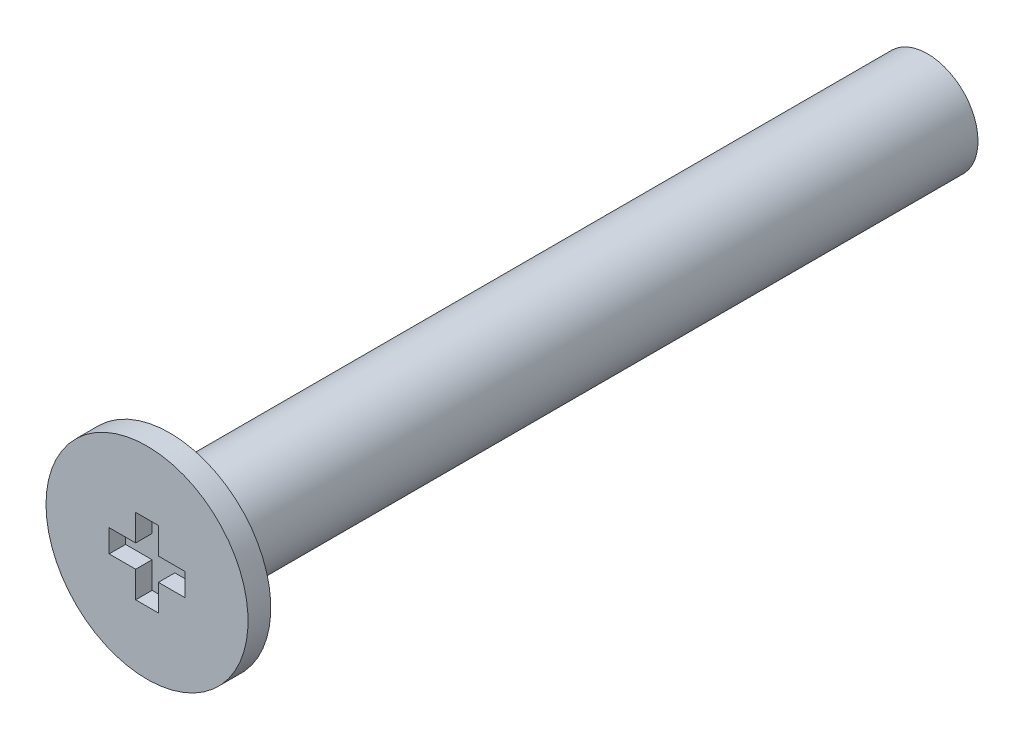
ISO-10303-21;
HEADER;
FILE_DESCRIPTION(('STEP AP214'),'2;1');
FILE_NAME('part.step','',(''),(''),'','','');
FILE_SCHEMA(('AUTOMOTIVE_DESIGN { 1 0 10303 214 1 1 1 1 }'));
ENDSEC;
DATA;
#1=APPLICATION_CONTEXT('core data for automotive mechanical design processes');
#2=APPLICATION_PROTOCOL_DEFINITION('international standard','automotive_design',2000,#1);
#3=PRODUCT_CONTEXT('',#1,'mechanical');
#4=PRODUCT('Part','Part','',(#3));
#5=PRODUCT_RELATED_PRODUCT_CATEGORY('part','',(#4));
#6=PRODUCT_DEFINITION_FORMATION('','',#4);
#7=PRODUCT_DEFINITION_CONTEXT('part definition',#1,'design');
#8=PRODUCT_DEFINITION('design','',#6,#7);
#9=PRODUCT_DEFINITION_SHAPE('','',#8);
#10=(LENGTH_UNIT() NAMED_UNIT(*) SI_UNIT(.MILLI.,.METRE.));
#11=(NAMED_UNIT(*) PLANE_ANGLE_UNIT() SI_UNIT($,.RADIAN.));
#12=(NAMED_UNIT(*) SI_UNIT($,.STERADIAN.) SOLID_ANGLE_UNIT());
#13=UNCERTAINTY_MEASURE_WITH_UNIT(LENGTH_MEASURE(1.E-05),#10,'distance_accuracy_value','');
#14=(GEOMETRIC_REPRESENTATION_CONTEXT(3) GLOBAL_UNCERTAINTY_ASSIGNED_CONTEXT((#13)) GLOBAL_UNIT_ASSIGNED_CONTEXT((#10,
#11,#12)) REPRESENTATION_CONTEXT('',''));
#15=CARTESIAN_POINT('',(0.,0.,0.));
#16=DIRECTION('',(0.,0.,1.));
#17=DIRECTION('',(1.,0.,0.));
#18=AXIS2_PLACEMENT_3D('',#15,#16,#17);
#19=CARTESIAN_POINT('',(0.,0.,-30.));
#20=DIRECTION('',(0.,0.,1.));
#21=DIRECTION('',(1.,0.,0.));
#22=AXIS2_PLACEMENT_3D('',#19,#20,#21);
#23=CYLINDRICAL_SURFACE('',#22,2.);
#24=CARTESIAN_POINT('',(0.,0.,-30.));
#25=DIRECTION('',(0.,0.,1.));
#26=DIRECTION('',(1.,0.,0.));
#27=AXIS2_PLACEMENT_3D('',#24,#25,#26);
#28=CIRCLE('',#27,2.);
#29=CARTESIAN_POINT('',(2.,0.,-30.));
#30=VERTEX_POINT('',#29);
#31=EDGE_CURVE('E212',#30,#30,#28,.T.);
#32=ORIENTED_EDGE('',*,*,#31,.T.);
#33=EDGE_LOOP('',(#32));
#34=FACE_BOUND('',#33,.T.);
#35=CARTESIAN_POINT('',(0.,0.,0.));
#36=DIRECTION('',(0.,0.,1.));
#37=DIRECTION('',(1.,0.,0.));
#38=AXIS2_PLACEMENT_3D('',#35,#36,#37);
#39=CIRCLE('',#38,2.);
#40=CARTESIAN_POINT('',(2.,0.,0.));
#41=VERTEX_POINT('',#40);
#42=EDGE_CURVE('E208',#41,#41,#39,.T.);
#43=ORIENTED_EDGE('',*,*,#42,.F.);
#44=EDGE_LOOP('',(#43));
#45=FACE_BOUND('',#44,.T.);
#46=ADVANCED_FACE('F41',(#34,#45),#23,.T.);
#47=CARTESIAN_POINT('',(0.,0.,-30.));
#48=DIRECTION('',(0.,0.,1.));
#49=DIRECTION('',(1.,0.,0.));
#50=AXIS2_PLACEMENT_3D('',#47,#48,#49);
#51=PLANE('',#50);
#52=ORIENTED_EDGE('',*,*,#31,.F.);
#53=EDGE_LOOP('',(#52));
#54=FACE_BOUND('',#53,.T.);
#55=ADVANCED_FACE('F281',(#54),#51,.F.);
#56=CARTESIAN_POINT('',(0.,0.,0.));
#57=DIRECTION('',(0.,0.,1.));
#58=DIRECTION('',(1.,0.,0.));
#59=AXIS2_PLACEMENT_3D('',#56,#57,#58);
#60=PLANE('',#59);
#61=ORIENTED_EDGE('',*,*,#42,.T.);
#62=EDGE_LOOP('',(#61));
#63=FACE_BOUND('',#62,.T.);
#64=CARTESIAN_POINT('',(0.,0.,0.));
#65=DIRECTION('',(0.,0.,-1.));
#66=DIRECTION('',(-1.,0.,0.));
#67=AXIS2_PLACEMENT_3D('',#64,#65,#66);
#68=CIRCLE('',#67,4.);
#69=CARTESIAN_POINT('',(-4.,0.,0.));
#70=VERTEX_POINT('',#69);
#71=EDGE_CURVE('E210',#70,#70,#68,.T.);
#72=ORIENTED_EDGE('',*,*,#71,.T.);
#73=EDGE_LOOP('',(#72));
#74=FACE_BOUND('',#73,.T.);
#75=ADVANCED_FACE('F286',(#63,#74),#60,.F.);
#76=CARTESIAN_POINT('',(0.,0.,-2.));
#77=DIRECTION('',(0.,0.,-1.));
#78=DIRECTION('',(-1.,0.,0.));
#79=AXIS2_PLACEMENT_3D('',#76,#77,#78);
#80=CYLINDRICAL_SURFACE('',#79,4.);
#81=ORIENTED_EDGE('',*,*,#71,.F.);
#82=EDGE_LOOP('',(#81));
#83=FACE_BOUND('',#82,.T.);
#84=CARTESIAN_POINT('',(0.,0.,0.9));
#85=DIRECTION('',(0.,0.,-1.));
#86=DIRECTION('',(-1.,0.,0.));
#87=AXIS2_PLACEMENT_3D('',#84,#85,#86);
#88=CIRCLE('',#87,4.);
#89=CARTESIAN_POINT('',(-4.,0.,0.9));
#90=VERTEX_POINT('',#89);
#91=EDGE_CURVE('E179',#90,#90,#88,.T.);
#92=ORIENTED_EDGE('',*,*,#91,.T.);
#93=EDGE_LOOP('',(#92));
#94=FACE_BOUND('',#93,.T.);
#95=ADVANCED_FACE('F300',(#83,#94),#80,.T.);
#96=CARTESIAN_POINT('',(4.,0.,0.9));
#97=DIRECTION('',(0.,0.,-1.));
#98=DIRECTION('',(-1.,0.,0.));
#99=AXIS2_PLACEMENT_3D('',#96,#97,#98);
#100=PLANE('',#99);
#101=DIRECTION('',(-1.,0.,0.));
#102=VECTOR('',#101,1.);
#103=CARTESIAN_POINT('',(4.,-1.5,0.9));
#104=LINE('',#103,#102);
#105=CARTESIAN_POINT('',(0.45,-1.5,0.9));
#106=VERTEX_POINT('',#105);
#107=CARTESIAN_POINT('',(-0.45,-1.5,0.9));
#108=VERTEX_POINT('',#107);
#109=EDGE_CURVE('E211',#106,#108,#104,.T.);
#110=ORIENTED_EDGE('',*,*,#109,.T.);
#111=DIRECTION('',(0.,1.,0.));
#112=VECTOR('',#111,1.);
#113=CARTESIAN_POINT('',(-0.45,0.,0.9));
#114=LINE('',#113,#112);
#115=CARTESIAN_POINT('',(-0.45,-0.45,0.9));
#116=VERTEX_POINT('',#115);
#117=EDGE_CURVE('E11',#108,#116,#114,.T.);
#118=ORIENTED_EDGE('',*,*,#117,.T.);
#119=DIRECTION('',(-1.,0.,0.));
#120=VECTOR('',#119,1.);
#121=CARTESIAN_POINT('',(4.,-0.45,0.9));
#122=LINE('',#121,#120);
#123=CARTESIAN_POINT('',(-1.5,-0.45,0.9));
#124=VERTEX_POINT('',#123);
#125=EDGE_CURVE('E48',#116,#124,#122,.T.);
#126=ORIENTED_EDGE('',*,*,#125,.T.);
#127=DIRECTION('',(0.,1.,0.));
#128=VECTOR('',#127,1.);
#129=CARTESIAN_POINT('',(-1.5,0.,0.9));
#130=LINE('',#129,#128);
#131=CARTESIAN_POINT('',(-1.5,0.45,0.9));
#132=VERTEX_POINT('',#131);
#133=EDGE_CURVE('E241',#124,#132,#130,.T.);
#134=ORIENTED_EDGE('',*,*,#133,.T.);
#135=DIRECTION('',(1.,0.,0.));
#136=VECTOR('',#135,1.);
#137=CARTESIAN_POINT('',(4.,0.45,0.9));
#138=LINE('',#137,#136);
#139=CARTESIAN_POINT('',(-0.45,0.45,0.9));
#140=VERTEX_POINT('',#139);
#141=EDGE_CURVE('E236',#132,#140,#138,.T.);
#142=ORIENTED_EDGE('',*,*,#141,.T.);
#143=DIRECTION('',(0.,1.,0.));
#144=VECTOR('',#143,1.);
#145=CARTESIAN_POINT('',(-0.45,0.,0.9));
#146=LINE('',#145,#144);
#147=CARTESIAN_POINT('',(-0.45,1.5,0.9));
#148=VERTEX_POINT('',#147);
#149=EDGE_CURVE('E237',#140,#148,#146,.T.);
#150=ORIENTED_EDGE('',*,*,#149,.T.);
#151=DIRECTION('',(1.,0.,0.));
#152=VECTOR('',#151,1.);
#153=CARTESIAN_POINT('',(4.,1.5,0.9));
#154=LINE('',#153,#152);
#155=CARTESIAN_POINT('',(0.45,1.5,0.9));
#156=VERTEX_POINT('',#155);
#157=EDGE_CURVE('E231',#148,#156,#154,.T.);
#158=ORIENTED_EDGE('',*,*,#157,.T.);
#159=DIRECTION('',(0.,-1.,0.));
#160=VECTOR('',#159,1.);
#161=CARTESIAN_POINT('',(0.45,0.,0.9));
#162=LINE('',#161,#160);
#163=CARTESIAN_POINT('',(0.45,0.45,0.9));
#164=VERTEX_POINT('',#163);
#165=EDGE_CURVE('E228',#156,#164,#162,.T.);
#166=ORIENTED_EDGE('',*,*,#165,.T.);
#167=DIRECTION('',(1.,0.,0.));
#168=VECTOR('',#167,1.);
#169=CARTESIAN_POINT('',(4.,0.45,0.9));
#170=LINE('',#169,#168);
#171=CARTESIAN_POINT('',(1.5,0.45,0.9));
#172=VERTEX_POINT('',#171);
#173=EDGE_CURVE('E229',#164,#172,#170,.T.);
#174=ORIENTED_EDGE('',*,*,#173,.T.);
#175=DIRECTION('',(0.,-1.,0.));
#176=VECTOR('',#175,1.);
#177=CARTESIAN_POINT('',(1.5,0.,0.9));
#178=LINE('',#177,#176);
#179=CARTESIAN_POINT('',(1.5,-0.45,0.9));
#180=VERTEX_POINT('',#179);
#181=EDGE_CURVE('E224',#172,#180,#178,.T.);
#182=ORIENTED_EDGE('',*,*,#181,.T.);
#183=DIRECTION('',(-1.,0.,0.));
#184=VECTOR('',#183,1.);
#185=CARTESIAN_POINT('',(4.,-0.45,0.9));
#186=LINE('',#185,#184);
#187=CARTESIAN_POINT('',(0.45,-0.45,0.9));
#188=VERTEX_POINT('',#187);
#189=EDGE_CURVE('E222',#180,#188,#186,.T.);
#190=ORIENTED_EDGE('',*,*,#189,.T.);
#191=DIRECTION('',(0.,-1.,0.));
#192=VECTOR('',#191,1.);
#193=CARTESIAN_POINT('',(0.45,0.,0.9));
#194=LINE('',#193,#192);
#195=EDGE_CURVE('E220',#188,#106,#194,.T.);
#196=ORIENTED_EDGE('',*,*,#195,.T.);
#197=EDGE_LOOP('',(#110,#118,#126,#134,#142,#150,#158,#166,#174,#182,#190,#196));
#198=FACE_BOUND('',#197,.T.);
#199=ORIENTED_EDGE('',*,*,#91,.F.);
#200=EDGE_LOOP('',(#199));
#201=FACE_BOUND('',#200,.T.);
#202=ADVANCED_FACE('F242',(#198,#201),#100,.F.);
#203=CARTESIAN_POINT('',(-0.45,-0.45,0.25));
#204=DIRECTION('',(-1.,0.,0.));
#205=DIRECTION('',(0.,0.,1.));
#206=AXIS2_PLACEMENT_3D('',#203,#204,#205);
#207=PLANE('',#206);
#208=DIRECTION('',(0.,0.,1.));
#209=VECTOR('',#208,1.);
#210=CARTESIAN_POINT('',(-0.45,-1.5,0.25));
#211=LINE('',#210,#209);
#212=CARTESIAN_POINT('',(-0.45,-1.5,0.25));
#213=VERTEX_POINT('',#212);
#214=EDGE_CURVE('E54',#213,#108,#211,.T.);
#215=ORIENTED_EDGE('',*,*,#214,.F.);
#216=DIRECTION('',(0.,-1.,0.));
#217=VECTOR('',#216,1.);
#218=CARTESIAN_POINT('',(-0.45,-0.45,0.25));
#219=LINE('',#218,#217);
#220=CARTESIAN_POINT('',(-0.45,-0.45,0.25));
#221=VERTEX_POINT('',#220);
#222=EDGE_CURVE('E129',#221,#213,#219,.T.);
#223=ORIENTED_EDGE('',*,*,#222,.F.);
#224=DIRECTION('',(0.,0.,1.));
#225=VECTOR('',#224,1.);
#226=CARTESIAN_POINT('',(-0.45,-0.45,0.25));
#227=LINE('',#226,#225);
#228=EDGE_CURVE('E171',#221,#116,#227,.T.);
#229=ORIENTED_EDGE('',*,*,#228,.T.);
#230=ORIENTED_EDGE('',*,*,#117,.F.);
#231=EDGE_LOOP('',(#215,#223,#229,#230));
#232=FACE_BOUND('',#231,.T.);
#233=ADVANCED_FACE('F127',(#232),#207,.F.);
#234=CARTESIAN_POINT('',(-1.5,-0.45,0.25));
#235=DIRECTION('',(0.,-1.,0.));
#236=DIRECTION('',(0.,0.,-1.));
#237=AXIS2_PLACEMENT_3D('',#234,#235,#236);
#238=PLANE('',#237);
#239=ORIENTED_EDGE('',*,*,#228,.F.);
#240=DIRECTION('',(1.,0.,0.));
#241=VECTOR('',#240,1.);
#242=CARTESIAN_POINT('',(-1.5,-0.45,0.25));
#243=LINE('',#242,#241);
#244=CARTESIAN_POINT('',(-1.5,-0.45,0.25));
#245=VERTEX_POINT('',#244);
#246=EDGE_CURVE('E131',#245,#221,#243,.T.);
#247=ORIENTED_EDGE('',*,*,#246,.F.);
#248=DIRECTION('',(0.,0.,1.));
#249=VECTOR('',#248,1.);
#250=CARTESIAN_POINT('',(-1.5,-0.45,0.25));
#251=LINE('',#250,#249);
#252=EDGE_CURVE('E180',#245,#124,#251,.T.);
#253=ORIENTED_EDGE('',*,*,#252,.T.);
#254=ORIENTED_EDGE('',*,*,#125,.F.);
#255=EDGE_LOOP('',(#239,#247,#253,#254));
#256=FACE_BOUND('',#255,.T.);
#257=ADVANCED_FACE('F273',(#256),#238,.F.);
#258=CARTESIAN_POINT('',(-1.5,0.45,0.25));
#259=DIRECTION('',(-1.,0.,0.));
#260=DIRECTION('',(0.,0.,1.));
#261=AXIS2_PLACEMENT_3D('',#258,#259,#260);
#262=PLANE('',#261);
#263=ORIENTED_EDGE('',*,*,#252,.F.);
#264=DIRECTION('',(0.,-1.,0.));
#265=VECTOR('',#264,1.);
#266=CARTESIAN_POINT('',(-1.5,0.45,0.25));
#267=LINE('',#266,#265);
#268=CARTESIAN_POINT('',(-1.5,0.45,0.25));
#269=VERTEX_POINT('',#268);
#270=EDGE_CURVE('E175',#269,#245,#267,.T.);
#271=ORIENTED_EDGE('',*,*,#270,.F.);
#272=DIRECTION('',(0.,0.,1.));
#273=VECTOR('',#272,1.);
#274=CARTESIAN_POINT('',(-1.5,0.45,0.25));
#275=LINE('',#274,#273);
#276=EDGE_CURVE('E178',#269,#132,#275,.T.);
#277=ORIENTED_EDGE('',*,*,#276,.T.);
#278=ORIENTED_EDGE('',*,*,#133,.F.);
#279=EDGE_LOOP('',(#263,#271,#277,#278));
#280=FACE_BOUND('',#279,.T.);
#281=ADVANCED_FACE('F275',(#280),#262,.F.);
#282=CARTESIAN_POINT('',(-0.45,0.45,0.25));
#283=DIRECTION('',(0.,1.,0.));
#284=DIRECTION('',(0.,0.,1.));
#285=AXIS2_PLACEMENT_3D('',#282,#283,#284);
#286=PLANE('',#285);
#287=ORIENTED_EDGE('',*,*,#276,.F.);
#288=DIRECTION('',(-1.,0.,0.));
#289=VECTOR('',#288,1.);
#290=CARTESIAN_POINT('',(-0.45,0.45,0.25));
#291=LINE('',#290,#289);
#292=CARTESIAN_POINT('',(-0.45,0.45,0.25));
#293=VERTEX_POINT('',#292);
#294=EDGE_CURVE('E168',#293,#269,#291,.T.);
#295=ORIENTED_EDGE('',*,*,#294,.F.);
#296=DIRECTION('',(0.,0.,1.));
#297=VECTOR('',#296,1.);
#298=CARTESIAN_POINT('',(-0.45,0.45,0.25));
#299=LINE('',#298,#297);
#300=EDGE_CURVE('E181',#293,#140,#299,.T.);
#301=ORIENTED_EDGE('',*,*,#300,.T.);
#302=ORIENTED_EDGE('',*,*,#141,.F.);
#303=EDGE_LOOP('',(#287,#295,#301,#302));
#304=FACE_BOUND('',#303,.T.);
#305=ADVANCED_FACE('F269',(#304),#286,.F.);
#306=CARTESIAN_POINT('',(-0.45,1.5,0.25));
#307=DIRECTION('',(-1.,0.,0.));
#308=DIRECTION('',(0.,0.,1.));
#309=AXIS2_PLACEMENT_3D('',#306,#307,#308);
#310=PLANE('',#309);
#311=ORIENTED_EDGE('',*,*,#300,.F.);
#312=DIRECTION('',(0.,-1.,0.));
#313=VECTOR('',#312,1.);
#314=CARTESIAN_POINT('',(-0.45,1.5,0.25));
#315=LINE('',#314,#313);
#316=CARTESIAN_POINT('',(-0.45,1.5,0.25));
#317=VERTEX_POINT('',#316);
#318=EDGE_CURVE('E169',#317,#293,#315,.T.);
#319=ORIENTED_EDGE('',*,*,#318,.F.);
#320=DIRECTION('',(0.,0.,1.));
#321=VECTOR('',#320,1.);
#322=CARTESIAN_POINT('',(-0.45,1.5,0.25));
#323=LINE('',#322,#321);
#324=EDGE_CURVE('E188',#317,#148,#323,.T.);
#325=ORIENTED_EDGE('',*,*,#324,.T.);
#326=ORIENTED_EDGE('',*,*,#149,.F.);
#327=EDGE_LOOP('',(#311,#319,#325,#326));
#328=FACE_BOUND('',#327,.T.);
#329=ADVANCED_FACE('F266',(#328),#310,.F.);
#330=CARTESIAN_POINT('',(0.45,1.5,0.25));
#331=DIRECTION('',(0.,1.,0.));
#332=DIRECTION('',(0.,0.,1.));
#333=AXIS2_PLACEMENT_3D('',#330,#331,#332);
#334=PLANE('',#333);
#335=ORIENTED_EDGE('',*,*,#324,.F.);
#336=DIRECTION('',(-1.,0.,0.));
#337=VECTOR('',#336,1.);
#338=CARTESIAN_POINT('',(0.45,1.5,0.25));
#339=LINE('',#338,#337);
#340=CARTESIAN_POINT('',(0.45,1.5,0.25));
#341=VERTEX_POINT('',#340);
#342=EDGE_CURVE('E164',#341,#317,#339,.T.);
#343=ORIENTED_EDGE('',*,*,#342,.F.);
#344=DIRECTION('',(0.,0.,1.));
#345=VECTOR('',#344,1.);
#346=CARTESIAN_POINT('',(0.45,1.5,0.25));
#347=LINE('',#346,#345);
#348=EDGE_CURVE('E189',#341,#156,#347,.T.);
#349=ORIENTED_EDGE('',*,*,#348,.T.);
#350=ORIENTED_EDGE('',*,*,#157,.F.);
#351=EDGE_LOOP('',(#335,#343,#349,#350));
#352=FACE_BOUND('',#351,.T.);
#353=ADVANCED_FACE('F261',(#352),#334,.F.);
#354=CARTESIAN_POINT('',(0.45,0.45,0.25));
#355=DIRECTION('',(1.,0.,0.));
#356=DIRECTION('',(0.,0.,-1.));
#357=AXIS2_PLACEMENT_3D('',#354,#355,#356);
#358=PLANE('',#357);
#359=ORIENTED_EDGE('',*,*,#348,.F.);
#360=DIRECTION('',(0.,1.,0.));
#361=VECTOR('',#360,1.);
#362=CARTESIAN_POINT('',(0.45,0.45,0.25));
#363=LINE('',#362,#361);
#364=CARTESIAN_POINT('',(0.45,0.45,0.25));
#365=VERTEX_POINT('',#364);
#366=EDGE_CURVE('E158',#365,#341,#363,.T.);
#367=ORIENTED_EDGE('',*,*,#366,.F.);
#368=DIRECTION('',(0.,0.,1.));
#369=VECTOR('',#368,1.);
#370=CARTESIAN_POINT('',(0.45,0.45,0.25));
#371=LINE('',#370,#369);
#372=EDGE_CURVE('E195',#365,#164,#371,.T.);
#373=ORIENTED_EDGE('',*,*,#372,.T.);
#374=ORIENTED_EDGE('',*,*,#165,.F.);
#375=EDGE_LOOP('',(#359,#367,#373,#374));
#376=FACE_BOUND('',#375,.T.);
#377=ADVANCED_FACE('F263',(#376),#358,.F.);
#378=CARTESIAN_POINT('',(1.5,0.45,0.25));
#379=DIRECTION('',(0.,1.,0.));
#380=DIRECTION('',(0.,0.,1.));
#381=AXIS2_PLACEMENT_3D('',#378,#379,#380);
#382=PLANE('',#381);
#383=ORIENTED_EDGE('',*,*,#372,.F.);
#384=DIRECTION('',(-1.,0.,0.));
#385=VECTOR('',#384,1.);
#386=CARTESIAN_POINT('',(1.5,0.45,0.25));
#387=LINE('',#386,#385);
#388=CARTESIAN_POINT('',(1.5,0.45,0.25));
#389=VERTEX_POINT('',#388);
#390=EDGE_CURVE('E160',#389,#365,#387,.T.);
#391=ORIENTED_EDGE('',*,*,#390,.F.);
#392=DIRECTION('',(0.,0.,1.));
#393=VECTOR('',#392,1.);
#394=CARTESIAN_POINT('',(1.5,0.45,0.25));
#395=LINE('',#394,#393);
#396=EDGE_CURVE('E194',#389,#172,#395,.T.);
#397=ORIENTED_EDGE('',*,*,#396,.T.);
#398=ORIENTED_EDGE('',*,*,#173,.F.);
#399=EDGE_LOOP('',(#383,#391,#397,#398));
#400=FACE_BOUND('',#399,.T.);
#401=ADVANCED_FACE('F257',(#400),#382,.F.);
#402=CARTESIAN_POINT('',(1.5,-0.45,0.25));
#403=DIRECTION('',(1.,0.,0.));
#404=DIRECTION('',(0.,0.,-1.));
#405=AXIS2_PLACEMENT_3D('',#402,#403,#404);
#406=PLANE('',#405);
#407=ORIENTED_EDGE('',*,*,#396,.F.);
#408=DIRECTION('',(0.,1.,0.));
#409=VECTOR('',#408,1.);
#410=CARTESIAN_POINT('',(1.5,-0.45,0.25));
#411=LINE('',#410,#409);
#412=CARTESIAN_POINT('',(1.5,-0.45,0.25));
#413=VERTEX_POINT('',#412);
#414=EDGE_CURVE('E151',#413,#389,#411,.T.);
#415=ORIENTED_EDGE('',*,*,#414,.F.);
#416=DIRECTION('',(0.,0.,1.));
#417=VECTOR('',#416,1.);
#418=CARTESIAN_POINT('',(1.5,-0.45,0.25));
#419=LINE('',#418,#417);
#420=EDGE_CURVE('E198',#413,#180,#419,.T.);
#421=ORIENTED_EDGE('',*,*,#420,.T.);
#422=ORIENTED_EDGE('',*,*,#181,.F.);
#423=EDGE_LOOP('',(#407,#415,#421,#422));
#424=FACE_BOUND('',#423,.T.);
#425=ADVANCED_FACE('F251',(#424),#406,.F.);
#426=CARTESIAN_POINT('',(0.45,-0.45,0.25));
#427=DIRECTION('',(0.,-1.,0.));
#428=DIRECTION('',(0.,0.,-1.));
#429=AXIS2_PLACEMENT_3D('',#426,#427,#428);
#430=PLANE('',#429);
#431=ORIENTED_EDGE('',*,*,#420,.F.);
#432=DIRECTION('',(1.,0.,0.));
#433=VECTOR('',#432,1.);
#434=CARTESIAN_POINT('',(0.45,-0.45,0.25));
#435=LINE('',#434,#433);
#436=CARTESIAN_POINT('',(0.45,-0.45,0.25));
#437=VERTEX_POINT('',#436);
#438=EDGE_CURVE('E152',#437,#413,#435,.T.);
#439=ORIENTED_EDGE('',*,*,#438,.F.);
#440=DIRECTION('',(0.,0.,1.));
#441=VECTOR('',#440,1.);
#442=CARTESIAN_POINT('',(0.45,-0.45,0.25));
#443=LINE('',#442,#441);
#444=EDGE_CURVE('E201',#437,#188,#443,.T.);
#445=ORIENTED_EDGE('',*,*,#444,.T.);
#446=ORIENTED_EDGE('',*,*,#189,.F.);
#447=EDGE_LOOP('',(#431,#439,#445,#446));
#448=FACE_BOUND('',#447,.T.);
#449=ADVANCED_FACE('F254',(#448),#430,.F.);
#450=CARTESIAN_POINT('',(0.45,-1.5,0.25));
#451=DIRECTION('',(1.,0.,0.));
#452=DIRECTION('',(0.,0.,-1.));
#453=AXIS2_PLACEMENT_3D('',#450,#451,#452);
#454=PLANE('',#453);
#455=ORIENTED_EDGE('',*,*,#444,.F.);
#456=DIRECTION('',(0.,1.,0.));
#457=VECTOR('',#456,1.);
#458=CARTESIAN_POINT('',(0.45,-1.5,0.25));
#459=LINE('',#458,#457);
#460=CARTESIAN_POINT('',(0.45,-1.5,0.25));
#461=VERTEX_POINT('',#460);
#462=EDGE_CURVE('E145',#461,#437,#459,.T.);
#463=ORIENTED_EDGE('',*,*,#462,.F.);
#464=DIRECTION('',(0.,0.,1.));
#465=VECTOR('',#464,1.);
#466=CARTESIAN_POINT('',(0.45,-1.5,0.25));
#467=LINE('',#466,#465);
#468=EDGE_CURVE('E134',#461,#106,#467,.T.);
#469=ORIENTED_EDGE('',*,*,#468,.T.);
#470=ORIENTED_EDGE('',*,*,#195,.F.);
#471=EDGE_LOOP('',(#455,#463,#469,#470));
#472=FACE_BOUND('',#471,.T.);
#473=ADVANCED_FACE('F248',(#472),#454,.F.);
#474=CARTESIAN_POINT('',(-0.45,-1.5,0.25));
#475=DIRECTION('',(0.,-1.,0.));
#476=DIRECTION('',(0.,0.,-1.));
#477=AXIS2_PLACEMENT_3D('',#474,#475,#476);
#478=PLANE('',#477);
#479=ORIENTED_EDGE('',*,*,#468,.F.);
#480=DIRECTION('',(1.,0.,0.));
#481=VECTOR('',#480,1.);
#482=CARTESIAN_POINT('',(-0.45,-1.5,0.25));
#483=LINE('',#482,#481);
#484=EDGE_CURVE('E140',#213,#461,#483,.T.);
#485=ORIENTED_EDGE('',*,*,#484,.F.);
#486=ORIENTED_EDGE('',*,*,#214,.T.);
#487=ORIENTED_EDGE('',*,*,#109,.F.);
#488=EDGE_LOOP('',(#479,#485,#486,#487));
#489=FACE_BOUND('',#488,.T.);
#490=ADVANCED_FACE('F139',(#489),#478,.F.);
#491=CARTESIAN_POINT('',(0.,0.,0.25));
#492=DIRECTION('',(0.,0.,1.));
#493=DIRECTION('',(1.,0.,0.));
#494=AXIS2_PLACEMENT_3D('',#491,#492,#493);
#495=PLANE('',#494);
#496=ORIENTED_EDGE('',*,*,#222,.T.);
#497=ORIENTED_EDGE('',*,*,#484,.T.);
#498=ORIENTED_EDGE('',*,*,#462,.T.);
#499=ORIENTED_EDGE('',*,*,#438,.T.);
#500=ORIENTED_EDGE('',*,*,#414,.T.);
#501=ORIENTED_EDGE('',*,*,#390,.T.);
#502=ORIENTED_EDGE('',*,*,#366,.T.);
#503=ORIENTED_EDGE('',*,*,#342,.T.);
#504=ORIENTED_EDGE('',*,*,#318,.T.);
#505=ORIENTED_EDGE('',*,*,#294,.T.);
#506=ORIENTED_EDGE('',*,*,#270,.T.);
#507=ORIENTED_EDGE('',*,*,#246,.T.);
#508=EDGE_LOOP('',(#496,#497,#498,#499,#500,#501,#502,#503,#504,#505,#506,#507));
#509=FACE_BOUND('',#508,.T.);
#510=ADVANCED_FACE('F142',(#509),#495,.T.);
#511=CLOSED_SHELL('',(#46,#55,#75,#95,#202,#233,#257,#281,#305,#329,#353,#377,#401,#425,#449,
#473,#490,#510));
#512=MANIFOLD_SOLID_BREP('B2',#511);
#513=ADVANCED_BREP_SHAPE_REPRESENTATION('',(#18,#512),#14);
#514=SHAPE_DEFINITION_REPRESENTATION(#9,#513);
ENDSEC;
END-ISO-10303-21;
